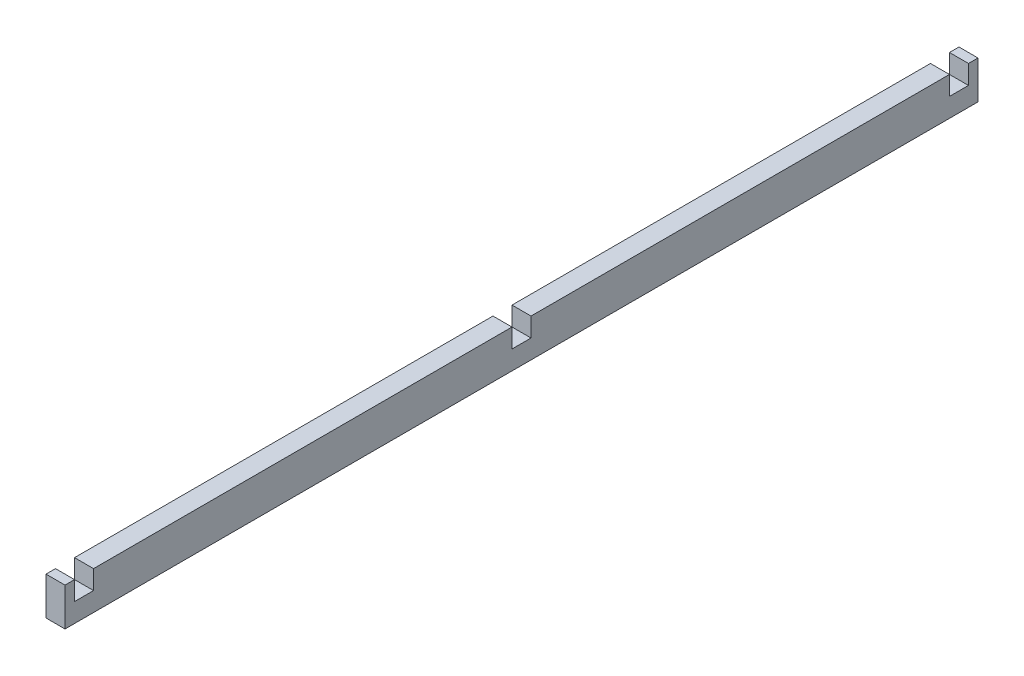
ISO-10303-21;
HEADER;
FILE_DESCRIPTION(('STEP AP214'),'2;1');
FILE_NAME('part.step','',(''),(''),'','','');
FILE_SCHEMA(('AUTOMOTIVE_DESIGN { 1 0 10303 214 1 1 1 1 }'));
ENDSEC;
DATA;
#1=APPLICATION_CONTEXT('core data for automotive mechanical design processes');
#2=APPLICATION_PROTOCOL_DEFINITION('international standard','automotive_design',2000,#1);
#3=PRODUCT_CONTEXT('',#1,'mechanical');
#4=PRODUCT('Part','Part','',(#3));
#5=PRODUCT_RELATED_PRODUCT_CATEGORY('part','',(#4));
#6=PRODUCT_DEFINITION_FORMATION('','',#4);
#7=PRODUCT_DEFINITION_CONTEXT('part definition',#1,'design');
#8=PRODUCT_DEFINITION('design','',#6,#7);
#9=PRODUCT_DEFINITION_SHAPE('','',#8);
#10=(LENGTH_UNIT() NAMED_UNIT(*) SI_UNIT(.MILLI.,.METRE.));
#11=(NAMED_UNIT(*) PLANE_ANGLE_UNIT() SI_UNIT($,.RADIAN.));
#12=(NAMED_UNIT(*) SI_UNIT($,.STERADIAN.) SOLID_ANGLE_UNIT());
#13=UNCERTAINTY_MEASURE_WITH_UNIT(LENGTH_MEASURE(1.E-05),#10,'distance_accuracy_value','');
#14=(GEOMETRIC_REPRESENTATION_CONTEXT(3) GLOBAL_UNCERTAINTY_ASSIGNED_CONTEXT((#13)) GLOBAL_UNIT_ASSIGNED_CONTEXT((#10,
#11,#12)) REPRESENTATION_CONTEXT('',''));
#15=CARTESIAN_POINT('',(0.,0.,0.));
#16=DIRECTION('',(0.,0.,1.));
#17=DIRECTION('',(1.,0.,0.));
#18=AXIS2_PLACEMENT_3D('',#15,#16,#17);
#19=CARTESIAN_POINT('',(-25.4,50.8,2438.4));
#20=DIRECTION('',(0.,-1.,0.));
#21=DIRECTION('',(0.,0.,-1.));
#22=AXIS2_PLACEMENT_3D('',#19,#20,#21);
#23=PLANE('',#22);
#24=DIRECTION('',(0.,0.,-1.));
#25=VECTOR('',#24,1.);
#26=CARTESIAN_POINT('',(25.4,50.8,2438.4));
#27=LINE('',#26,#25);
#28=CARTESIAN_POINT('',(25.4,50.8,2438.4));
#29=VERTEX_POINT('',#28);
#30=CARTESIAN_POINT('',(25.4,50.8,2413.));
#31=VERTEX_POINT('',#30);
#32=EDGE_CURVE('E11',#29,#31,#27,.T.);
#33=ORIENTED_EDGE('',*,*,#32,.T.);
#34=DIRECTION('',(1.,0.,0.));
#35=VECTOR('',#34,1.);
#36=CARTESIAN_POINT('',(-25.4,50.8,2413.));
#37=LINE('',#36,#35);
#38=CARTESIAN_POINT('',(-25.4,50.8,2413.));
#39=VERTEX_POINT('',#38);
#40=EDGE_CURVE('E192',#39,#31,#37,.T.);
#41=ORIENTED_EDGE('',*,*,#40,.F.);
#42=DIRECTION('',(0.,0.,-1.));
#43=VECTOR('',#42,1.);
#44=CARTESIAN_POINT('',(-25.4,50.8,2438.4));
#45=LINE('',#44,#43);
#46=CARTESIAN_POINT('',(-25.4,50.8,2438.4));
#47=VERTEX_POINT('',#46);
#48=EDGE_CURVE('E182',#47,#39,#45,.T.);
#49=ORIENTED_EDGE('',*,*,#48,.F.);
#50=DIRECTION('',(-1.,0.,0.));
#51=VECTOR('',#50,1.);
#52=CARTESIAN_POINT('',(-25.4,50.8,2438.4));
#53=LINE('',#52,#51);
#54=EDGE_CURVE('E286',#29,#47,#53,.T.);
#55=ORIENTED_EDGE('',*,*,#54,.F.);
#56=EDGE_LOOP('',(#33,#41,#49,#55));
#57=FACE_BOUND('',#56,.T.);
#58=ADVANCED_FACE('F43',(#57),#23,.F.);
#59=CARTESIAN_POINT('',(-25.4,50.8,1193.8));
#60=VERTEX_POINT('',#59);
#61=CARTESIAN_POINT('',(-25.4,50.8,76.2000000000009));
#62=VERTEX_POINT('',#61);
#63=EDGE_CURVE('E322',#60,#62,#45,.T.);
#64=ORIENTED_EDGE('',*,*,#63,.F.);
#65=DIRECTION('',(1.,0.,0.));
#66=VECTOR('',#65,1.);
#67=CARTESIAN_POINT('',(-25.4,50.8,1193.8));
#68=LINE('',#67,#66);
#69=CARTESIAN_POINT('',(25.4,50.8,1193.8));
#70=VERTEX_POINT('',#69);
#71=EDGE_CURVE('E213',#60,#70,#68,.T.);
#72=ORIENTED_EDGE('',*,*,#71,.T.);
#73=CARTESIAN_POINT('',(25.4,50.8,76.2000000000009));
#74=VERTEX_POINT('',#73);
#75=EDGE_CURVE('E320',#70,#74,#27,.T.);
#76=ORIENTED_EDGE('',*,*,#75,.T.);
#77=DIRECTION('',(1.,0.,0.));
#78=VECTOR('',#77,1.);
#79=CARTESIAN_POINT('',(-25.4,50.8,76.2000000000009));
#80=LINE('',#79,#78);
#81=EDGE_CURVE('E223',#62,#74,#80,.T.);
#82=ORIENTED_EDGE('',*,*,#81,.F.);
#83=EDGE_LOOP('',(#64,#72,#76,#82));
#84=FACE_BOUND('',#83,.T.);
#85=ADVANCED_FACE('F331',(#84),#23,.F.);
#86=CARTESIAN_POINT('',(-25.4,50.8,25.4000000000008));
#87=VERTEX_POINT('',#86);
#88=CARTESIAN_POINT('',(-25.4,50.8,0.));
#89=VERTEX_POINT('',#88);
#90=EDGE_CURVE('E315',#87,#89,#45,.T.);
#91=ORIENTED_EDGE('',*,*,#90,.F.);
#92=DIRECTION('',(1.,0.,0.));
#93=VECTOR('',#92,1.);
#94=CARTESIAN_POINT('',(-25.4,50.8,25.4000000000008));
#95=LINE('',#94,#93);
#96=CARTESIAN_POINT('',(25.4,50.8,25.4000000000008));
#97=VERTEX_POINT('',#96);
#98=EDGE_CURVE('E235',#87,#97,#95,.T.);
#99=ORIENTED_EDGE('',*,*,#98,.T.);
#100=CARTESIAN_POINT('',(25.4,50.8,0.));
#101=VERTEX_POINT('',#100);
#102=EDGE_CURVE('E53',#97,#101,#27,.T.);
#103=ORIENTED_EDGE('',*,*,#102,.T.);
#104=DIRECTION('',(-1.,0.,0.));
#105=VECTOR('',#104,1.);
#106=CARTESIAN_POINT('',(-25.4,50.8,0.));
#107=LINE('',#106,#105);
#108=EDGE_CURVE('E300',#101,#89,#107,.T.);
#109=ORIENTED_EDGE('',*,*,#108,.T.);
#110=EDGE_LOOP('',(#91,#99,#103,#109));
#111=FACE_BOUND('',#110,.T.);
#112=ADVANCED_FACE('F345',(#111),#23,.F.);
#113=CARTESIAN_POINT('',(25.4,-50.8,2438.4));
#114=DIRECTION('',(-1.,0.,0.));
#115=DIRECTION('',(0.,-1.,0.));
#116=AXIS2_PLACEMENT_3D('',#113,#114,#115);
#117=PLANE('',#116);
#118=DIRECTION('',(0.,0.,1.));
#119=VECTOR('',#118,1.);
#120=CARTESIAN_POINT('',(25.4,0.,2438.4));
#121=LINE('',#120,#119);
#122=CARTESIAN_POINT('',(25.4,0.,2362.2));
#123=VERTEX_POINT('',#122);
#124=CARTESIAN_POINT('',(25.4,0.,2413.));
#125=VERTEX_POINT('',#124);
#126=EDGE_CURVE('E272',#123,#125,#121,.T.);
#127=ORIENTED_EDGE('',*,*,#126,.T.);
#128=DIRECTION('',(0.,1.,0.));
#129=VECTOR('',#128,1.);
#130=CARTESIAN_POINT('',(25.4,-50.8,2413.));
#131=LINE('',#130,#129);
#132=EDGE_CURVE('E166',#125,#31,#131,.T.);
#133=ORIENTED_EDGE('',*,*,#132,.T.);
#134=ORIENTED_EDGE('',*,*,#32,.F.);
#135=DIRECTION('',(0.,1.,0.));
#136=VECTOR('',#135,1.);
#137=CARTESIAN_POINT('',(25.4,-50.8,2438.4));
#138=LINE('',#137,#136);
#139=CARTESIAN_POINT('',(25.4,-50.8,2438.4));
#140=VERTEX_POINT('',#139);
#141=EDGE_CURVE('E282',#140,#29,#138,.T.);
#142=ORIENTED_EDGE('',*,*,#141,.F.);
#143=DIRECTION('',(0.,0.,-1.));
#144=VECTOR('',#143,1.);
#145=CARTESIAN_POINT('',(25.4,-50.8,2438.4));
#146=LINE('',#145,#144);
#147=CARTESIAN_POINT('',(25.4,-50.8,0.));
#148=VERTEX_POINT('',#147);
#149=EDGE_CURVE('E296',#140,#148,#146,.T.);
#150=ORIENTED_EDGE('',*,*,#149,.T.);
#151=DIRECTION('',(0.,1.,0.));
#152=VECTOR('',#151,1.);
#153=CARTESIAN_POINT('',(25.4,-50.8,0.));
#154=LINE('',#153,#152);
#155=EDGE_CURVE('E281',#148,#101,#154,.T.);
#156=ORIENTED_EDGE('',*,*,#155,.T.);
#157=ORIENTED_EDGE('',*,*,#102,.F.);
#158=DIRECTION('',(0.,-1.,0.));
#159=VECTOR('',#158,1.);
#160=CARTESIAN_POINT('',(25.4,-50.8,25.4000000000008));
#161=LINE('',#160,#159);
#162=CARTESIAN_POINT('',(25.4,0.,25.4000000000008));
#163=VERTEX_POINT('',#162);
#164=EDGE_CURVE('E256',#97,#163,#161,.T.);
#165=ORIENTED_EDGE('',*,*,#164,.T.);
#166=DIRECTION('',(0.,0.,1.));
#167=VECTOR('',#166,1.);
#168=CARTESIAN_POINT('',(25.4,0.,2438.4));
#169=LINE('',#168,#167);
#170=CARTESIAN_POINT('',(25.4,0.,76.2000000000009));
#171=VERTEX_POINT('',#170);
#172=EDGE_CURVE('E252',#163,#171,#169,.T.);
#173=ORIENTED_EDGE('',*,*,#172,.T.);
#174=DIRECTION('',(0.,1.,0.));
#175=VECTOR('',#174,1.);
#176=CARTESIAN_POINT('',(25.4,-50.8,76.2000000000009));
#177=LINE('',#176,#175);
#178=EDGE_CURVE('E195',#171,#74,#177,.T.);
#179=ORIENTED_EDGE('',*,*,#178,.T.);
#180=ORIENTED_EDGE('',*,*,#75,.F.);
#181=DIRECTION('',(0.,-1.,0.));
#182=VECTOR('',#181,1.);
#183=CARTESIAN_POINT('',(25.4,-50.8,1193.8));
#184=LINE('',#183,#182);
#185=CARTESIAN_POINT('',(25.4,0.,1193.8));
#186=VERTEX_POINT('',#185);
#187=EDGE_CURVE('E268',#70,#186,#184,.T.);
#188=ORIENTED_EDGE('',*,*,#187,.T.);
#189=DIRECTION('',(0.,0.,1.));
#190=VECTOR('',#189,1.);
#191=CARTESIAN_POINT('',(25.4,0.,2438.4));
#192=LINE('',#191,#190);
#193=CARTESIAN_POINT('',(25.4,0.,1244.6));
#194=VERTEX_POINT('',#193);
#195=EDGE_CURVE('E264',#186,#194,#192,.T.);
#196=ORIENTED_EDGE('',*,*,#195,.T.);
#197=DIRECTION('',(0.,1.,0.));
#198=VECTOR('',#197,1.);
#199=CARTESIAN_POINT('',(25.4,-50.8,1244.6));
#200=LINE('',#199,#198);
#201=CARTESIAN_POINT('',(25.4,50.8,1244.6));
#202=VERTEX_POINT('',#201);
#203=EDGE_CURVE('E260',#194,#202,#200,.T.);
#204=ORIENTED_EDGE('',*,*,#203,.T.);
#205=CARTESIAN_POINT('',(25.4,50.8,2362.2));
#206=VERTEX_POINT('',#205);
#207=EDGE_CURVE('E52',#206,#202,#27,.T.);
#208=ORIENTED_EDGE('',*,*,#207,.F.);
#209=DIRECTION('',(0.,-1.,0.));
#210=VECTOR('',#209,1.);
#211=CARTESIAN_POINT('',(25.4,-50.8,2362.2));
#212=LINE('',#211,#210);
#213=EDGE_CURVE('E275',#206,#123,#212,.T.);
#214=ORIENTED_EDGE('',*,*,#213,.T.);
#215=EDGE_LOOP('',(#127,#133,#134,#142,#150,#156,#157,#165,#173,#179,#180,#188,#196,#204,#208,#214));
#216=FACE_BOUND('',#215,.T.);
#217=ADVANCED_FACE('F45',(#216),#117,.F.);
#218=CARTESIAN_POINT('',(-25.4,50.8,2362.2));
#219=VERTEX_POINT('',#218);
#220=CARTESIAN_POINT('',(-25.4,50.8,1244.6));
#221=VERTEX_POINT('',#220);
#222=EDGE_CURVE('E317',#219,#221,#45,.T.);
#223=ORIENTED_EDGE('',*,*,#222,.F.);
#224=DIRECTION('',(1.,0.,0.));
#225=VECTOR('',#224,1.);
#226=CARTESIAN_POINT('',(-25.4,50.8,2362.2));
#227=LINE('',#226,#225);
#228=EDGE_CURVE('E196',#219,#206,#227,.T.);
#229=ORIENTED_EDGE('',*,*,#228,.T.);
#230=ORIENTED_EDGE('',*,*,#207,.T.);
#231=DIRECTION('',(1.,0.,0.));
#232=VECTOR('',#231,1.);
#233=CARTESIAN_POINT('',(-25.4,50.8,1244.6));
#234=LINE('',#233,#232);
#235=EDGE_CURVE('E202',#221,#202,#234,.T.);
#236=ORIENTED_EDGE('',*,*,#235,.F.);
#237=EDGE_LOOP('',(#223,#229,#230,#236));
#238=FACE_BOUND('',#237,.T.);
#239=ADVANCED_FACE('F367',(#238),#23,.F.);
#240=CARTESIAN_POINT('',(-25.4,-50.8,2438.4));
#241=DIRECTION('',(1.,0.,0.));
#242=DIRECTION('',(0.,0.,-1.));
#243=AXIS2_PLACEMENT_3D('',#240,#241,#242);
#244=PLANE('',#243);
#245=ORIENTED_EDGE('',*,*,#48,.T.);
#246=DIRECTION('',(0.,-1.,0.));
#247=VECTOR('',#246,1.);
#248=CARTESIAN_POINT('',(-25.4,50.8,2413.));
#249=LINE('',#248,#247);
#250=CARTESIAN_POINT('',(-25.4,0.,2413.));
#251=VERTEX_POINT('',#250);
#252=EDGE_CURVE('E163',#39,#251,#249,.T.);
#253=ORIENTED_EDGE('',*,*,#252,.T.);
#254=DIRECTION('',(0.,0.,-1.));
#255=VECTOR('',#254,1.);
#256=CARTESIAN_POINT('',(-25.4,0.,2413.));
#257=LINE('',#256,#255);
#258=CARTESIAN_POINT('',(-25.4,0.,2362.2));
#259=VERTEX_POINT('',#258);
#260=EDGE_CURVE('E173',#251,#259,#257,.T.);
#261=ORIENTED_EDGE('',*,*,#260,.T.);
#262=DIRECTION('',(0.,1.,0.));
#263=VECTOR('',#262,1.);
#264=CARTESIAN_POINT('',(-25.4,50.8,2362.2));
#265=LINE('',#264,#263);
#266=EDGE_CURVE('E60',#259,#219,#265,.T.);
#267=ORIENTED_EDGE('',*,*,#266,.T.);
#268=ORIENTED_EDGE('',*,*,#222,.T.);
#269=DIRECTION('',(0.,-1.,0.));
#270=VECTOR('',#269,1.);
#271=CARTESIAN_POINT('',(-25.4,50.8,1244.6));
#272=LINE('',#271,#270);
#273=CARTESIAN_POINT('',(-25.4,0.,1244.6));
#274=VERTEX_POINT('',#273);
#275=EDGE_CURVE('E184',#221,#274,#272,.T.);
#276=ORIENTED_EDGE('',*,*,#275,.T.);
#277=DIRECTION('',(0.,0.,-1.));
#278=VECTOR('',#277,1.);
#279=CARTESIAN_POINT('',(-25.4,0.,1244.6));
#280=LINE('',#279,#278);
#281=CARTESIAN_POINT('',(-25.4,0.,1193.8));
#282=VERTEX_POINT('',#281);
#283=EDGE_CURVE('E68',#274,#282,#280,.T.);
#284=ORIENTED_EDGE('',*,*,#283,.T.);
#285=DIRECTION('',(0.,1.,0.));
#286=VECTOR('',#285,1.);
#287=CARTESIAN_POINT('',(-25.4,50.8,1193.8));
#288=LINE('',#287,#286);
#289=EDGE_CURVE('E205',#282,#60,#288,.T.);
#290=ORIENTED_EDGE('',*,*,#289,.T.);
#291=ORIENTED_EDGE('',*,*,#63,.T.);
#292=DIRECTION('',(0.,-1.,0.));
#293=VECTOR('',#292,1.);
#294=CARTESIAN_POINT('',(-25.4,50.8,76.2000000000009));
#295=LINE('',#294,#293);
#296=CARTESIAN_POINT('',(-25.4,0.,76.2000000000009));
#297=VERTEX_POINT('',#296);
#298=EDGE_CURVE('E217',#62,#297,#295,.T.);
#299=ORIENTED_EDGE('',*,*,#298,.T.);
#300=DIRECTION('',(0.,0.,-1.));
#301=VECTOR('',#300,1.);
#302=CARTESIAN_POINT('',(-25.4,0.,76.2000000000009));
#303=LINE('',#302,#301);
#304=CARTESIAN_POINT('',(-25.4,0.,25.4000000000008));
#305=VERTEX_POINT('',#304);
#306=EDGE_CURVE('E242',#297,#305,#303,.T.);
#307=ORIENTED_EDGE('',*,*,#306,.T.);
#308=DIRECTION('',(0.,1.,0.));
#309=VECTOR('',#308,1.);
#310=CARTESIAN_POINT('',(-25.4,50.8,25.4000000000008));
#311=LINE('',#310,#309);
#312=EDGE_CURVE('E226',#305,#87,#311,.T.);
#313=ORIENTED_EDGE('',*,*,#312,.T.);
#314=ORIENTED_EDGE('',*,*,#90,.T.);
#315=DIRECTION('',(0.,-1.,0.));
#316=VECTOR('',#315,1.);
#317=CARTESIAN_POINT('',(-25.4,-50.8,0.));
#318=LINE('',#317,#316);
#319=CARTESIAN_POINT('',(-25.4,-50.8,0.));
#320=VERTEX_POINT('',#319);
#321=EDGE_CURVE('E304',#89,#320,#318,.T.);
#322=ORIENTED_EDGE('',*,*,#321,.T.);
#323=DIRECTION('',(0.,0.,-1.));
#324=VECTOR('',#323,1.);
#325=CARTESIAN_POINT('',(-25.4,-50.8,2438.4));
#326=LINE('',#325,#324);
#327=CARTESIAN_POINT('',(-25.4,-50.8,2438.4));
#328=VERTEX_POINT('',#327);
#329=EDGE_CURVE('E312',#328,#320,#326,.T.);
#330=ORIENTED_EDGE('',*,*,#329,.F.);
#331=DIRECTION('',(0.,-1.,0.));
#332=VECTOR('',#331,1.);
#333=CARTESIAN_POINT('',(-25.4,-50.8,2438.4));
#334=LINE('',#333,#332);
#335=EDGE_CURVE('E290',#47,#328,#334,.T.);
#336=ORIENTED_EDGE('',*,*,#335,.F.);
#337=EDGE_LOOP('',(#245,#253,#261,#267,#268,#276,#284,#290,#291,#299,#307,#313,#314,#322,#330,#336));
#338=FACE_BOUND('',#337,.T.);
#339=ADVANCED_FACE('F179',(#338),#244,.F.);
#340=CARTESIAN_POINT('',(-25.4,-50.8,2438.4));
#341=DIRECTION('',(0.,1.,0.));
#342=DIRECTION('',(0.,0.,1.));
#343=AXIS2_PLACEMENT_3D('',#340,#341,#342);
#344=PLANE('',#343);
#345=DIRECTION('',(1.,0.,0.));
#346=VECTOR('',#345,1.);
#347=CARTESIAN_POINT('',(-25.4,-50.8,0.));
#348=LINE('',#347,#346);
#349=EDGE_CURVE('E287',#320,#148,#348,.T.);
#350=ORIENTED_EDGE('',*,*,#349,.T.);
#351=ORIENTED_EDGE('',*,*,#149,.F.);
#352=DIRECTION('',(1.,0.,0.));
#353=VECTOR('',#352,1.);
#354=CARTESIAN_POINT('',(-25.4,-50.8,2438.4));
#355=LINE('',#354,#353);
#356=EDGE_CURVE('E293',#328,#140,#355,.T.);
#357=ORIENTED_EDGE('',*,*,#356,.F.);
#358=ORIENTED_EDGE('',*,*,#329,.T.);
#359=EDGE_LOOP('',(#350,#351,#357,#358));
#360=FACE_BOUND('',#359,.T.);
#361=ADVANCED_FACE('F355',(#360),#344,.F.);
#362=CARTESIAN_POINT('',(0.,0.,2438.4));
#363=DIRECTION('',(0.,0.,-1.));
#364=DIRECTION('',(-1.,0.,0.));
#365=AXIS2_PLACEMENT_3D('',#362,#363,#364);
#366=PLANE('',#365);
#367=ORIENTED_EDGE('',*,*,#141,.T.);
#368=ORIENTED_EDGE('',*,*,#54,.T.);
#369=ORIENTED_EDGE('',*,*,#335,.T.);
#370=ORIENTED_EDGE('',*,*,#356,.T.);
#371=EDGE_LOOP('',(#367,#368,#369,#370));
#372=FACE_BOUND('',#371,.T.);
#373=ADVANCED_FACE('F359',(#372),#366,.F.);
#374=CARTESIAN_POINT('',(0.,0.,0.));
#375=DIRECTION('',(0.,0.,-1.));
#376=DIRECTION('',(-1.,0.,0.));
#377=AXIS2_PLACEMENT_3D('',#374,#375,#376);
#378=PLANE('',#377);
#379=ORIENTED_EDGE('',*,*,#155,.F.);
#380=ORIENTED_EDGE('',*,*,#349,.F.);
#381=ORIENTED_EDGE('',*,*,#321,.F.);
#382=ORIENTED_EDGE('',*,*,#108,.F.);
#383=EDGE_LOOP('',(#379,#380,#381,#382));
#384=FACE_BOUND('',#383,.T.);
#385=ADVANCED_FACE('F351',(#384),#378,.T.);
#386=CARTESIAN_POINT('',(-25.4,50.8,25.4000000000008));
#387=DIRECTION('',(0.,0.,-1.));
#388=DIRECTION('',(-1.,0.,0.));
#389=AXIS2_PLACEMENT_3D('',#386,#387,#388);
#390=PLANE('',#389);
#391=ORIENTED_EDGE('',*,*,#98,.F.);
#392=ORIENTED_EDGE('',*,*,#312,.F.);
#393=DIRECTION('',(1.,0.,0.));
#394=VECTOR('',#393,1.);
#395=CARTESIAN_POINT('',(-25.4,0.,25.4000000000008));
#396=LINE('',#395,#394);
#397=EDGE_CURVE('E231',#305,#163,#396,.T.);
#398=ORIENTED_EDGE('',*,*,#397,.T.);
#399=ORIENTED_EDGE('',*,*,#164,.F.);
#400=EDGE_LOOP('',(#391,#392,#398,#399));
#401=FACE_BOUND('',#400,.T.);
#402=ADVANCED_FACE('F343',(#401),#390,.F.);
#403=CARTESIAN_POINT('',(-25.4,0.,76.2000000000009));
#404=DIRECTION('',(0.,-1.,0.));
#405=DIRECTION('',(1.,0.,0.));
#406=AXIS2_PLACEMENT_3D('',#403,#404,#405);
#407=PLANE('',#406);
#408=ORIENTED_EDGE('',*,*,#397,.F.);
#409=ORIENTED_EDGE('',*,*,#306,.F.);
#410=DIRECTION('',(1.,0.,0.));
#411=VECTOR('',#410,1.);
#412=CARTESIAN_POINT('',(-25.4,0.,76.2000000000009));
#413=LINE('',#412,#411);
#414=EDGE_CURVE('E227',#297,#171,#413,.T.);
#415=ORIENTED_EDGE('',*,*,#414,.T.);
#416=ORIENTED_EDGE('',*,*,#172,.F.);
#417=EDGE_LOOP('',(#408,#409,#415,#416));
#418=FACE_BOUND('',#417,.T.);
#419=ADVANCED_FACE('F340',(#418),#407,.F.);
#420=CARTESIAN_POINT('',(-25.4,50.8,76.2000000000009));
#421=DIRECTION('',(0.,0.,1.));
#422=DIRECTION('',(1.,0.,0.));
#423=AXIS2_PLACEMENT_3D('',#420,#421,#422);
#424=PLANE('',#423);
#425=ORIENTED_EDGE('',*,*,#414,.F.);
#426=ORIENTED_EDGE('',*,*,#298,.F.);
#427=ORIENTED_EDGE('',*,*,#81,.T.);
#428=ORIENTED_EDGE('',*,*,#178,.F.);
#429=EDGE_LOOP('',(#425,#426,#427,#428));
#430=FACE_BOUND('',#429,.T.);
#431=ADVANCED_FACE('F336',(#430),#424,.F.);
#432=CARTESIAN_POINT('',(-25.4,50.8,1193.8));
#433=DIRECTION('',(0.,0.,-1.));
#434=DIRECTION('',(-1.,0.,0.));
#435=AXIS2_PLACEMENT_3D('',#432,#433,#434);
#436=PLANE('',#435);
#437=ORIENTED_EDGE('',*,*,#71,.F.);
#438=ORIENTED_EDGE('',*,*,#289,.F.);
#439=DIRECTION('',(1.,0.,0.));
#440=VECTOR('',#439,1.);
#441=CARTESIAN_POINT('',(-25.4,0.,1193.8));
#442=LINE('',#441,#440);
#443=EDGE_CURVE('E209',#282,#186,#442,.T.);
#444=ORIENTED_EDGE('',*,*,#443,.T.);
#445=ORIENTED_EDGE('',*,*,#187,.F.);
#446=EDGE_LOOP('',(#437,#438,#444,#445));
#447=FACE_BOUND('',#446,.T.);
#448=ADVANCED_FACE('F375',(#447),#436,.F.);
#449=CARTESIAN_POINT('',(-25.4,0.,1244.6));
#450=DIRECTION('',(0.,-1.,0.));
#451=DIRECTION('',(1.,0.,0.));
#452=AXIS2_PLACEMENT_3D('',#449,#450,#451);
#453=PLANE('',#452);
#454=ORIENTED_EDGE('',*,*,#443,.F.);
#455=ORIENTED_EDGE('',*,*,#283,.F.);
#456=DIRECTION('',(1.,0.,0.));
#457=VECTOR('',#456,1.);
#458=CARTESIAN_POINT('',(-25.4,0.,1244.6));
#459=LINE('',#458,#457);
#460=EDGE_CURVE('E206',#274,#194,#459,.T.);
#461=ORIENTED_EDGE('',*,*,#460,.T.);
#462=ORIENTED_EDGE('',*,*,#195,.F.);
#463=EDGE_LOOP('',(#454,#455,#461,#462));
#464=FACE_BOUND('',#463,.T.);
#465=ADVANCED_FACE('F373',(#464),#453,.F.);
#466=CARTESIAN_POINT('',(-25.4,50.8,1244.6));
#467=DIRECTION('',(0.,0.,1.));
#468=DIRECTION('',(1.,0.,0.));
#469=AXIS2_PLACEMENT_3D('',#466,#467,#468);
#470=PLANE('',#469);
#471=ORIENTED_EDGE('',*,*,#460,.F.);
#472=ORIENTED_EDGE('',*,*,#275,.F.);
#473=ORIENTED_EDGE('',*,*,#235,.T.);
#474=ORIENTED_EDGE('',*,*,#203,.F.);
#475=EDGE_LOOP('',(#471,#472,#473,#474));
#476=FACE_BOUND('',#475,.T.);
#477=ADVANCED_FACE('F372',(#476),#470,.F.);
#478=CARTESIAN_POINT('',(-25.4,50.8,2413.));
#479=DIRECTION('',(0.,0.,1.));
#480=DIRECTION('',(1.,0.,0.));
#481=AXIS2_PLACEMENT_3D('',#478,#479,#480);
#482=PLANE('',#481);
#483=DIRECTION('',(1.,0.,0.));
#484=VECTOR('',#483,1.);
#485=CARTESIAN_POINT('',(-25.4,0.,2413.));
#486=LINE('',#485,#484);
#487=EDGE_CURVE('E159',#251,#125,#486,.T.);
#488=ORIENTED_EDGE('',*,*,#487,.F.);
#489=ORIENTED_EDGE('',*,*,#252,.F.);
#490=ORIENTED_EDGE('',*,*,#40,.T.);
#491=ORIENTED_EDGE('',*,*,#132,.F.);
#492=EDGE_LOOP('',(#488,#489,#490,#491));
#493=FACE_BOUND('',#492,.T.);
#494=ADVANCED_FACE('F161',(#493),#482,.F.);
#495=CARTESIAN_POINT('',(-25.4,50.8,2362.2));
#496=DIRECTION('',(0.,0.,-1.));
#497=DIRECTION('',(-1.,0.,0.));
#498=AXIS2_PLACEMENT_3D('',#495,#496,#497);
#499=PLANE('',#498);
#500=ORIENTED_EDGE('',*,*,#228,.F.);
#501=ORIENTED_EDGE('',*,*,#266,.F.);
#502=DIRECTION('',(1.,0.,0.));
#503=VECTOR('',#502,1.);
#504=CARTESIAN_POINT('',(-25.4,0.,2362.2));
#505=LINE('',#504,#503);
#506=EDGE_CURVE('E170',#259,#123,#505,.T.);
#507=ORIENTED_EDGE('',*,*,#506,.T.);
#508=ORIENTED_EDGE('',*,*,#213,.F.);
#509=EDGE_LOOP('',(#500,#501,#507,#508));
#510=FACE_BOUND('',#509,.T.);
#511=ADVANCED_FACE('F363',(#510),#499,.F.);
#512=CARTESIAN_POINT('',(-25.4,0.,2413.));
#513=DIRECTION('',(0.,-1.,0.));
#514=DIRECTION('',(1.,0.,0.));
#515=AXIS2_PLACEMENT_3D('',#512,#513,#514);
#516=PLANE('',#515);
#517=ORIENTED_EDGE('',*,*,#506,.F.);
#518=ORIENTED_EDGE('',*,*,#260,.F.);
#519=ORIENTED_EDGE('',*,*,#487,.T.);
#520=ORIENTED_EDGE('',*,*,#126,.F.);
#521=EDGE_LOOP('',(#517,#518,#519,#520));
#522=FACE_BOUND('',#521,.T.);
#523=ADVANCED_FACE('F174',(#522),#516,.F.);
#524=CLOSED_SHELL('',(#58,#85,#112,#217,#239,#339,#361,#373,#385,#402,#419,#431,#448,#465,#477,
#494,#511,#523));
#525=MANIFOLD_SOLID_BREP('B2',#524);
#526=ADVANCED_BREP_SHAPE_REPRESENTATION('',(#18,#525),#14);
#527=SHAPE_DEFINITION_REPRESENTATION(#9,#526);
ENDSEC;
END-ISO-10303-21;
